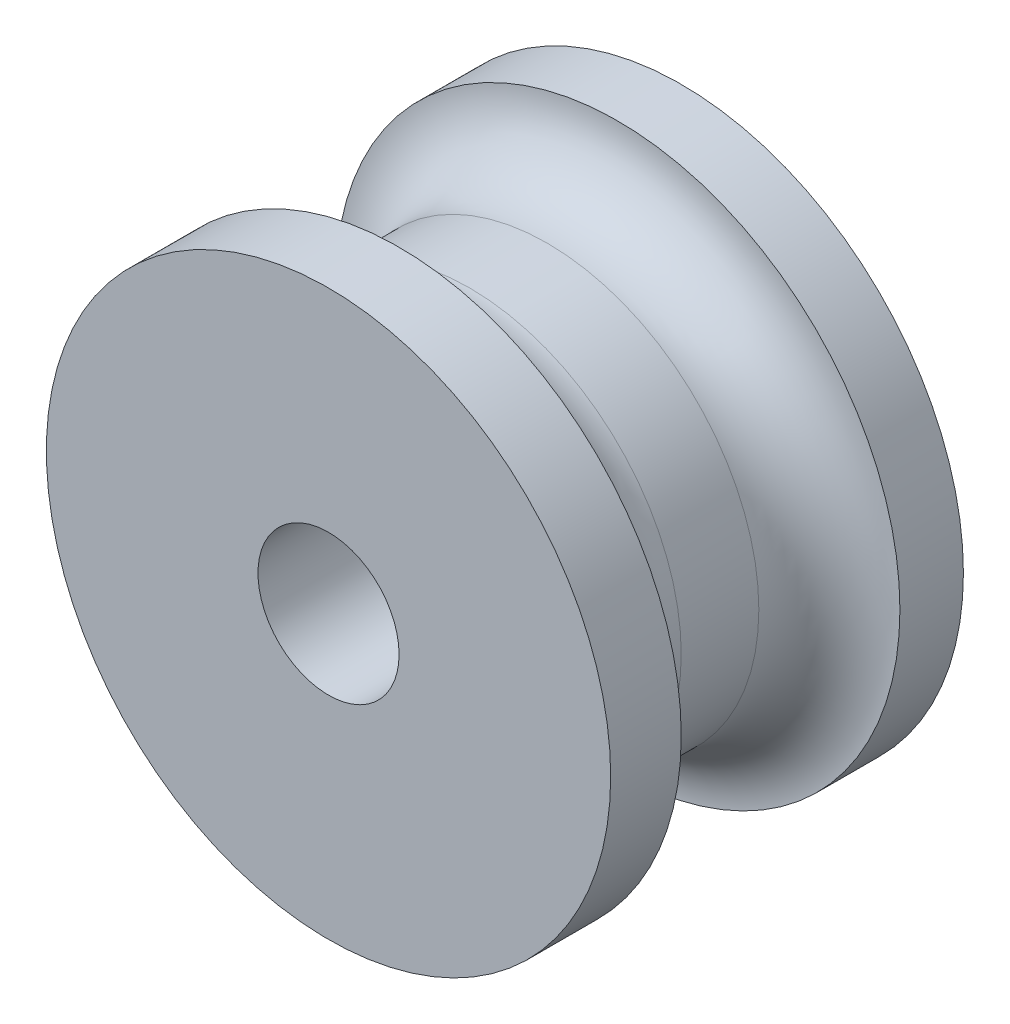
ISO-10303-21;
HEADER;
FILE_DESCRIPTION(('STEP AP214'),'2;1');
FILE_NAME('part.step','',(''),(''),'','','');
FILE_SCHEMA(('AUTOMOTIVE_DESIGN { 1 0 10303 214 1 1 1 1 }'));
ENDSEC;
DATA;
#1=APPLICATION_CONTEXT('core data for automotive mechanical design processes');
#2=APPLICATION_PROTOCOL_DEFINITION('international standard','automotive_design',2000,#1);
#3=PRODUCT_CONTEXT('',#1,'mechanical');
#4=PRODUCT('Part','Part','',(#3));
#5=PRODUCT_RELATED_PRODUCT_CATEGORY('part','',(#4));
#6=PRODUCT_DEFINITION_FORMATION('','',#4);
#7=PRODUCT_DEFINITION_CONTEXT('part definition',#1,'design');
#8=PRODUCT_DEFINITION('design','',#6,#7);
#9=PRODUCT_DEFINITION_SHAPE('','',#8);
#10=(LENGTH_UNIT() NAMED_UNIT(*) SI_UNIT(.MILLI.,.METRE.));
#11=(NAMED_UNIT(*) PLANE_ANGLE_UNIT() SI_UNIT($,.RADIAN.));
#12=(NAMED_UNIT(*) SI_UNIT($,.STERADIAN.) SOLID_ANGLE_UNIT());
#13=UNCERTAINTY_MEASURE_WITH_UNIT(LENGTH_MEASURE(1.E-05),#10,'distance_accuracy_value','');
#14=(GEOMETRIC_REPRESENTATION_CONTEXT(3) GLOBAL_UNCERTAINTY_ASSIGNED_CONTEXT((#13)) GLOBAL_UNIT_ASSIGNED_CONTEXT((#10,
#11,#12)) REPRESENTATION_CONTEXT('',''));
#15=CARTESIAN_POINT('',(0.,0.,0.));
#16=DIRECTION('',(0.,0.,1.));
#17=DIRECTION('',(1.,0.,0.));
#18=AXIS2_PLACEMENT_3D('',#15,#16,#17);
#19=CARTESIAN_POINT('',(0.,0.,19.));
#20=DIRECTION('',(0.,0.,1.));
#21=DIRECTION('',(1.,0.,0.));
#22=AXIS2_PLACEMENT_3D('',#19,#20,#21);
#23=TOROIDAL_SURFACE('',#22,40.,10.);
#24=CARTESIAN_POINT('',(0.,0.,9.00000000000001));
#25=DIRECTION('',(0.,0.,1.));
#26=DIRECTION('',(1.,0.,0.));
#27=AXIS2_PLACEMENT_3D('',#24,#25,#26);
#28=CIRCLE('',#27,40.);
#29=CARTESIAN_POINT('',(40.,0.,9.00000000000001));
#30=VERTEX_POINT('',#29);
#31=EDGE_CURVE('E81',#30,#30,#28,.T.);
#32=ORIENTED_EDGE('',*,*,#31,.T.);
#33=EDGE_LOOP('',(#32));
#34=FACE_BOUND('',#33,.T.);
#35=CARTESIAN_POINT('',(0.,0.,19.));
#36=DIRECTION('',(0.,0.,1.));
#37=DIRECTION('',(1.,0.,0.));
#38=AXIS2_PLACEMENT_3D('',#35,#36,#37);
#39=CIRCLE('',#38,30.);
#40=CARTESIAN_POINT('',(30.,0.,19.));
#41=VERTEX_POINT('',#40);
#42=EDGE_CURVE('E12',#41,#41,#39,.T.);
#43=ORIENTED_EDGE('',*,*,#42,.F.);
#44=EDGE_LOOP('',(#43));
#45=FACE_BOUND('',#44,.T.);
#46=ADVANCED_FACE('F64',(#34,#45),#23,.F.);
#47=CARTESIAN_POINT('',(0.,0.,30.));
#48=DIRECTION('',(0.,0.,1.));
#49=DIRECTION('',(1.,0.,0.));
#50=AXIS2_PLACEMENT_3D('',#47,#48,#49);
#51=TOROIDAL_SURFACE('',#50,40.,10.);
#52=CARTESIAN_POINT('',(0.,0.,40.));
#53=DIRECTION('',(0.,0.,1.));
#54=DIRECTION('',(1.,0.,0.));
#55=AXIS2_PLACEMENT_3D('',#52,#53,#54);
#56=CIRCLE('',#55,40.);
#57=CARTESIAN_POINT('',(40.,0.,40.));
#58=VERTEX_POINT('',#57);
#59=EDGE_CURVE('E84',#58,#58,#56,.T.);
#60=ORIENTED_EDGE('',*,*,#59,.F.);
#61=EDGE_LOOP('',(#60));
#62=FACE_BOUND('',#61,.T.);
#63=CARTESIAN_POINT('',(0.,0.,30.));
#64=DIRECTION('',(0.,0.,1.));
#65=DIRECTION('',(1.,0.,0.));
#66=AXIS2_PLACEMENT_3D('',#63,#64,#65);
#67=CIRCLE('',#66,30.);
#68=CARTESIAN_POINT('',(30.,0.,30.));
#69=VERTEX_POINT('',#68);
#70=EDGE_CURVE('E70',#69,#69,#67,.F.);
#71=ORIENTED_EDGE('',*,*,#70,.F.);
#72=EDGE_LOOP('',(#71));
#73=FACE_BOUND('',#72,.T.);
#74=ADVANCED_FACE('F118',(#62,#73),#51,.F.);
#75=CARTESIAN_POINT('',(0.,0.,50.));
#76=DIRECTION('',(0.,0.,-1.));
#77=DIRECTION('',(-1.,0.,0.));
#78=AXIS2_PLACEMENT_3D('',#75,#76,#77);
#79=CYLINDRICAL_SURFACE('',#78,40.);
#80=CARTESIAN_POINT('',(0.,0.,0.));
#81=DIRECTION('',(0.,0.,1.));
#82=DIRECTION('',(1.,0.,0.));
#83=AXIS2_PLACEMENT_3D('',#80,#81,#82);
#84=CIRCLE('',#83,40.);
#85=CARTESIAN_POINT('',(40.,0.,0.));
#86=VERTEX_POINT('',#85);
#87=EDGE_CURVE('E78',#86,#86,#84,.T.);
#88=ORIENTED_EDGE('',*,*,#87,.T.);
#89=EDGE_LOOP('',(#88));
#90=FACE_BOUND('',#89,.T.);
#91=ORIENTED_EDGE('',*,*,#31,.F.);
#92=EDGE_LOOP('',(#91));
#93=FACE_BOUND('',#92,.T.);
#94=ADVANCED_FACE('F109',(#90,#93),#79,.T.);
#95=CARTESIAN_POINT('',(0.,0.,0.));
#96=DIRECTION('',(0.,0.,1.));
#97=DIRECTION('',(1.,0.,0.));
#98=AXIS2_PLACEMENT_3D('',#95,#96,#97);
#99=PLANE('',#98);
#100=CARTESIAN_POINT('',(0.,0.,0.));
#101=DIRECTION('',(0.,0.,1.));
#102=DIRECTION('',(1.,0.,0.));
#103=AXIS2_PLACEMENT_3D('',#100,#101,#102);
#104=CIRCLE('',#103,10.);
#105=CARTESIAN_POINT('',(10.,0.,0.));
#106=VERTEX_POINT('',#105);
#107=EDGE_CURVE('E87',#106,#106,#104,.T.);
#108=ORIENTED_EDGE('',*,*,#107,.T.);
#109=EDGE_LOOP('',(#108));
#110=FACE_BOUND('',#109,.T.);
#111=ORIENTED_EDGE('',*,*,#87,.F.);
#112=EDGE_LOOP('',(#111));
#113=FACE_BOUND('',#112,.T.);
#114=ADVANCED_FACE('F117',(#110,#113),#99,.F.);
#115=CARTESIAN_POINT('',(0.,0.,9.00000000000001));
#116=DIRECTION('',(0.,0.,1.));
#117=DIRECTION('',(1.,0.,0.));
#118=AXIS2_PLACEMENT_3D('',#115,#116,#117);
#119=CYLINDRICAL_SURFACE('',#118,30.);
#120=ORIENTED_EDGE('',*,*,#42,.T.);
#121=EDGE_LOOP('',(#120));
#122=FACE_BOUND('',#121,.T.);
#123=ORIENTED_EDGE('',*,*,#70,.T.);
#124=EDGE_LOOP('',(#123));
#125=FACE_BOUND('',#124,.T.);
#126=ADVANCED_FACE('F102',(#122,#125),#119,.T.);
#127=CARTESIAN_POINT('',(0.,0.,50.));
#128=DIRECTION('',(0.,0.,1.));
#129=DIRECTION('',(1.,0.,0.));
#130=AXIS2_PLACEMENT_3D('',#127,#128,#129);
#131=PLANE('',#130);
#132=CARTESIAN_POINT('',(0.,0.,50.));
#133=DIRECTION('',(0.,0.,1.));
#134=DIRECTION('',(1.,0.,0.));
#135=AXIS2_PLACEMENT_3D('',#132,#133,#134);
#136=CIRCLE('',#135,10.);
#137=CARTESIAN_POINT('',(10.,0.,50.));
#138=VERTEX_POINT('',#137);
#139=EDGE_CURVE('E92',#138,#138,#136,.T.);
#140=ORIENTED_EDGE('',*,*,#139,.F.);
#141=EDGE_LOOP('',(#140));
#142=FACE_BOUND('',#141,.T.);
#143=CARTESIAN_POINT('',(0.,0.,50.));
#144=DIRECTION('',(0.,0.,1.));
#145=DIRECTION('',(1.,0.,0.));
#146=AXIS2_PLACEMENT_3D('',#143,#144,#145);
#147=CIRCLE('',#146,40.);
#148=CARTESIAN_POINT('',(40.,0.,50.));
#149=VERTEX_POINT('',#148);
#150=EDGE_CURVE('E74',#149,#149,#147,.T.);
#151=ORIENTED_EDGE('',*,*,#150,.T.);
#152=EDGE_LOOP('',(#151));
#153=FACE_BOUND('',#152,.T.);
#154=ADVANCED_FACE('F98',(#142,#153),#131,.T.);
#155=ORIENTED_EDGE('',*,*,#59,.T.);
#156=EDGE_LOOP('',(#155));
#157=FACE_BOUND('',#156,.T.);
#158=ORIENTED_EDGE('',*,*,#150,.F.);
#159=EDGE_LOOP('',(#158));
#160=FACE_BOUND('',#159,.T.);
#161=ADVANCED_FACE('F101',(#157,#160),#79,.T.);
#162=CARTESIAN_POINT('',(0.,0.,0.));
#163=DIRECTION('',(0.,0.,1.));
#164=DIRECTION('',(1.,0.,0.));
#165=AXIS2_PLACEMENT_3D('',#162,#163,#164);
#166=CYLINDRICAL_SURFACE('',#165,10.);
#167=ORIENTED_EDGE('',*,*,#107,.F.);
#168=EDGE_LOOP('',(#167));
#169=FACE_BOUND('',#168,.T.);
#170=ORIENTED_EDGE('',*,*,#139,.T.);
#171=EDGE_LOOP('',(#170));
#172=FACE_BOUND('',#171,.T.);
#173=ADVANCED_FACE('F96',(#169,#172),#166,.F.);
#174=CLOSED_SHELL('',(#46,#74,#94,#114,#126,#154,#161,#173));
#175=MANIFOLD_SOLID_BREP('B2',#174);
#176=ADVANCED_BREP_SHAPE_REPRESENTATION('',(#18,#175),#14);
#177=SHAPE_DEFINITION_REPRESENTATION(#9,#176);
ENDSEC;
END-ISO-10303-21;
